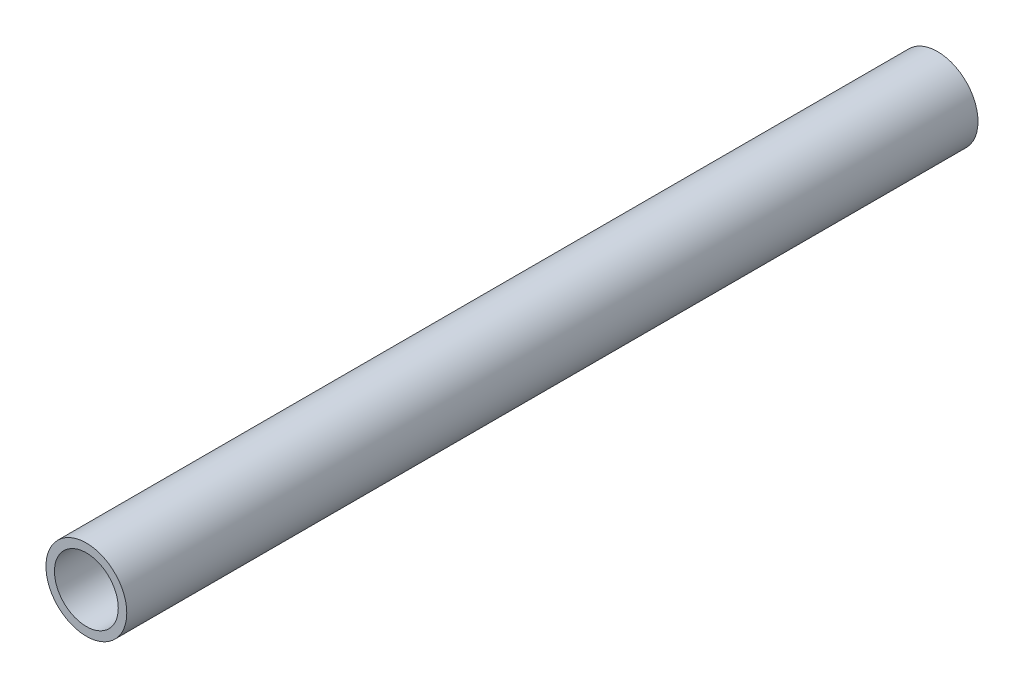
ISO-10303-21;
HEADER;
FILE_DESCRIPTION(('STEP AP214'),'2;1');
FILE_NAME('part.step','',(''),(''),'','','');
FILE_SCHEMA(('AUTOMOTIVE_DESIGN { 1 0 10303 214 1 1 1 1 }'));
ENDSEC;
DATA;
#1=APPLICATION_CONTEXT('core data for automotive mechanical design processes');
#2=APPLICATION_PROTOCOL_DEFINITION('international standard','automotive_design',2000,#1);
#3=PRODUCT_CONTEXT('',#1,'mechanical');
#4=PRODUCT('Part','Part','',(#3));
#5=PRODUCT_RELATED_PRODUCT_CATEGORY('part','',(#4));
#6=PRODUCT_DEFINITION_FORMATION('','',#4);
#7=PRODUCT_DEFINITION_CONTEXT('part definition',#1,'design');
#8=PRODUCT_DEFINITION('design','',#6,#7);
#9=PRODUCT_DEFINITION_SHAPE('','',#8);
#10=(LENGTH_UNIT() NAMED_UNIT(*) SI_UNIT(.MILLI.,.METRE.));
#11=(NAMED_UNIT(*) PLANE_ANGLE_UNIT() SI_UNIT($,.RADIAN.));
#12=(NAMED_UNIT(*) SI_UNIT($,.STERADIAN.) SOLID_ANGLE_UNIT());
#13=UNCERTAINTY_MEASURE_WITH_UNIT(LENGTH_MEASURE(1.E-05),#10,'distance_accuracy_value','');
#14=(GEOMETRIC_REPRESENTATION_CONTEXT(3) GLOBAL_UNCERTAINTY_ASSIGNED_CONTEXT((#13)) GLOBAL_UNIT_ASSIGNED_CONTEXT((#10,
#11,#12)) REPRESENTATION_CONTEXT('',''));
#15=CARTESIAN_POINT('',(0.,0.,0.));
#16=DIRECTION('',(0.,0.,1.));
#17=DIRECTION('',(1.,0.,0.));
#18=AXIS2_PLACEMENT_3D('',#15,#16,#17);
#19=CARTESIAN_POINT('',(0.,0.,200.));
#20=DIRECTION('',(0.,0.,1.));
#21=DIRECTION('',(1.,0.,0.));
#22=AXIS2_PLACEMENT_3D('',#19,#20,#21);
#23=PLANE('',#22);
#24=CARTESIAN_POINT('',(0.,0.,200.));
#25=DIRECTION('',(0.,0.,1.));
#26=DIRECTION('',(1.,0.,0.));
#27=AXIS2_PLACEMENT_3D('',#24,#25,#26);
#28=CIRCLE('',#27,9.5);
#29=CARTESIAN_POINT('',(9.5,0.,200.));
#30=VERTEX_POINT('',#29);
#31=EDGE_CURVE('E10',#30,#30,#28,.T.);
#32=ORIENTED_EDGE('',*,*,#31,.T.);
#33=EDGE_LOOP('',(#32));
#34=FACE_BOUND('',#33,.T.);
#35=CARTESIAN_POINT('',(0.,0.,200.));
#36=DIRECTION('',(0.,0.,1.));
#37=DIRECTION('',(1.,0.,0.));
#38=AXIS2_PLACEMENT_3D('',#35,#36,#37);
#39=CIRCLE('',#38,7.5);
#40=CARTESIAN_POINT('',(7.5,0.,200.));
#41=VERTEX_POINT('',#40);
#42=EDGE_CURVE('E46',#41,#41,#39,.T.);
#43=ORIENTED_EDGE('',*,*,#42,.F.);
#44=EDGE_LOOP('',(#43));
#45=FACE_BOUND('',#44,.T.);
#46=ADVANCED_FACE('F35',(#34,#45),#23,.T.);
#47=CARTESIAN_POINT('',(0.,0.,0.));
#48=DIRECTION('',(0.,0.,1.));
#49=DIRECTION('',(1.,0.,0.));
#50=AXIS2_PLACEMENT_3D('',#47,#48,#49);
#51=PLANE('',#50);
#52=CARTESIAN_POINT('',(0.,0.,0.));
#53=DIRECTION('',(0.,0.,1.));
#54=DIRECTION('',(1.,0.,0.));
#55=AXIS2_PLACEMENT_3D('',#52,#53,#54);
#56=CIRCLE('',#55,9.5);
#57=CARTESIAN_POINT('',(9.5,0.,0.));
#58=VERTEX_POINT('',#57);
#59=EDGE_CURVE('E39',#58,#58,#56,.T.);
#60=ORIENTED_EDGE('',*,*,#59,.F.);
#61=EDGE_LOOP('',(#60));
#62=FACE_BOUND('',#61,.T.);
#63=CARTESIAN_POINT('',(0.,0.,0.));
#64=DIRECTION('',(0.,0.,1.));
#65=DIRECTION('',(1.,0.,0.));
#66=AXIS2_PLACEMENT_3D('',#63,#64,#65);
#67=CIRCLE('',#66,7.5);
#68=CARTESIAN_POINT('',(7.5,0.,0.));
#69=VERTEX_POINT('',#68);
#70=EDGE_CURVE('E48',#69,#69,#67,.T.);
#71=ORIENTED_EDGE('',*,*,#70,.T.);
#72=EDGE_LOOP('',(#71));
#73=FACE_BOUND('',#72,.T.);
#74=ADVANCED_FACE('F58',(#62,#73),#51,.F.);
#75=CARTESIAN_POINT('',(0.,0.,200.));
#76=DIRECTION('',(0.,0.,-1.));
#77=DIRECTION('',(-1.,0.,0.));
#78=AXIS2_PLACEMENT_3D('',#75,#76,#77);
#79=CYLINDRICAL_SURFACE('',#78,9.5);
#80=ORIENTED_EDGE('',*,*,#31,.F.);
#81=EDGE_LOOP('',(#80));
#82=FACE_BOUND('',#81,.T.);
#83=ORIENTED_EDGE('',*,*,#59,.T.);
#84=EDGE_LOOP('',(#83));
#85=FACE_BOUND('',#84,.T.);
#86=ADVANCED_FACE('F37',(#82,#85),#79,.T.);
#87=CARTESIAN_POINT('',(0.,0.,200.));
#88=DIRECTION('',(0.,0.,-1.));
#89=DIRECTION('',(-1.,0.,0.));
#90=AXIS2_PLACEMENT_3D('',#87,#88,#89);
#91=CYLINDRICAL_SURFACE('',#90,7.5);
#92=ORIENTED_EDGE('',*,*,#42,.T.);
#93=EDGE_LOOP('',(#92));
#94=FACE_BOUND('',#93,.T.);
#95=ORIENTED_EDGE('',*,*,#70,.F.);
#96=EDGE_LOOP('',(#95));
#97=FACE_BOUND('',#96,.T.);
#98=ADVANCED_FACE('F54',(#94,#97),#91,.F.);
#99=CLOSED_SHELL('',(#46,#74,#86,#98));
#100=MANIFOLD_SOLID_BREP('B2',#99);
#101=ADVANCED_BREP_SHAPE_REPRESENTATION('',(#18,#100),#14);
#102=SHAPE_DEFINITION_REPRESENTATION(#9,#101);
ENDSEC;
END-ISO-10303-21;
